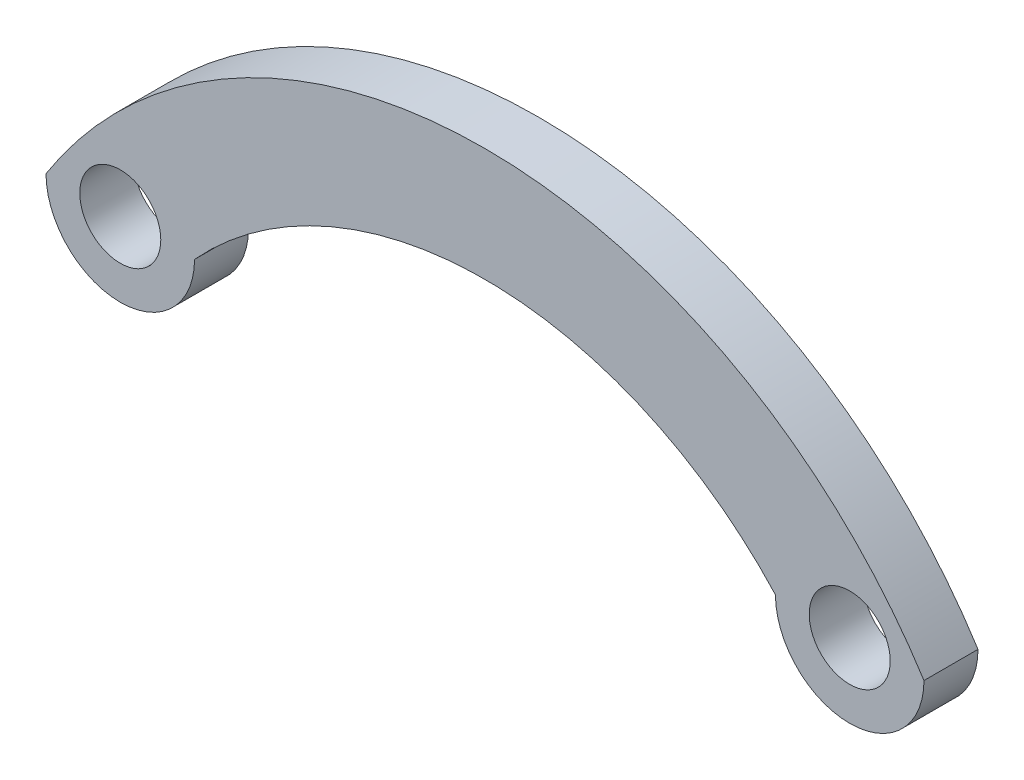
ISO-10303-21;
HEADER;
FILE_DESCRIPTION(('STEP AP214'),'2;1');
FILE_NAME('part.step','',(''),(''),'','','');
FILE_SCHEMA(('AUTOMOTIVE_DESIGN { 1 0 10303 214 1 1 1 1 }'));
ENDSEC;
DATA;
#1=APPLICATION_CONTEXT('core data for automotive mechanical design processes');
#2=APPLICATION_PROTOCOL_DEFINITION('international standard','automotive_design',2000,#1);
#3=PRODUCT_CONTEXT('',#1,'mechanical');
#4=PRODUCT('Part','Part','',(#3));
#5=PRODUCT_RELATED_PRODUCT_CATEGORY('part','',(#4));
#6=PRODUCT_DEFINITION_FORMATION('','',#4);
#7=PRODUCT_DEFINITION_CONTEXT('part definition',#1,'design');
#8=PRODUCT_DEFINITION('design','',#6,#7);
#9=PRODUCT_DEFINITION_SHAPE('','',#8);
#10=(LENGTH_UNIT() NAMED_UNIT(*) SI_UNIT(.MILLI.,.METRE.));
#11=(NAMED_UNIT(*) PLANE_ANGLE_UNIT() SI_UNIT($,.RADIAN.));
#12=(NAMED_UNIT(*) SI_UNIT($,.STERADIAN.) SOLID_ANGLE_UNIT());
#13=UNCERTAINTY_MEASURE_WITH_UNIT(LENGTH_MEASURE(1.E-05),#10,'distance_accuracy_value','');
#14=(GEOMETRIC_REPRESENTATION_CONTEXT(3) GLOBAL_UNCERTAINTY_ASSIGNED_CONTEXT((#13)) GLOBAL_UNIT_ASSIGNED_CONTEXT((#10,
#11,#12)) REPRESENTATION_CONTEXT('',''));
#15=CARTESIAN_POINT('',(0.,0.,0.));
#16=DIRECTION('',(0.,0.,1.));
#17=DIRECTION('',(1.,0.,0.));
#18=AXIS2_PLACEMENT_3D('',#15,#16,#17);
#19=CARTESIAN_POINT('',(5.5,0.,4.));
#20=DIRECTION('',(0.,0.,-1.));
#21=DIRECTION('',(-1.,0.,0.));
#22=AXIS2_PLACEMENT_3D('',#19,#20,#21);
#23=CYLINDRICAL_SURFACE('',#22,5.5);
#24=CARTESIAN_POINT('',(5.5,0.,0.));
#25=DIRECTION('',(0.,0.,1.));
#26=DIRECTION('',(1.,0.,0.));
#27=AXIS2_PLACEMENT_3D('',#24,#25,#26);
#28=CIRCLE('',#27,5.5);
#29=CARTESIAN_POINT('',(0.,0.,0.));
#30=VERTEX_POINT('',#29);
#31=CARTESIAN_POINT('',(11.,0.,0.));
#32=VERTEX_POINT('',#31);
#33=EDGE_CURVE('E96',#30,#32,#28,.T.);
#34=ORIENTED_EDGE('',*,*,#33,.T.);
#35=DIRECTION('',(0.,0.,-1.));
#36=VECTOR('',#35,1.);
#37=CARTESIAN_POINT('',(11.,0.,4.));
#38=LINE('',#37,#36);
#39=CARTESIAN_POINT('',(11.,0.,4.));
#40=VERTEX_POINT('',#39);
#41=EDGE_CURVE('E11',#40,#32,#38,.T.);
#42=ORIENTED_EDGE('',*,*,#41,.F.);
#43=CARTESIAN_POINT('',(5.5,0.,4.));
#44=DIRECTION('',(0.,0.,1.));
#45=DIRECTION('',(1.,0.,0.));
#46=AXIS2_PLACEMENT_3D('',#43,#44,#45);
#47=CIRCLE('',#46,5.5);
#48=CARTESIAN_POINT('',(0.,0.,4.));
#49=VERTEX_POINT('',#48);
#50=EDGE_CURVE('E84',#49,#40,#47,.T.);
#51=ORIENTED_EDGE('',*,*,#50,.F.);
#52=DIRECTION('',(0.,0.,-1.));
#53=VECTOR('',#52,1.);
#54=CARTESIAN_POINT('',(0.,0.,4.));
#55=LINE('',#54,#53);
#56=EDGE_CURVE('E92',#49,#30,#55,.T.);
#57=ORIENTED_EDGE('',*,*,#56,.T.);
#58=EDGE_LOOP('',(#34,#42,#51,#57));
#59=FACE_BOUND('',#58,.T.);
#60=ADVANCED_FACE('F33',(#59),#23,.T.);
#61=CARTESIAN_POINT('',(32.5084600569508,-19.6845144983669,4.));
#62=DIRECTION('',(0.,0.,-1.));
#63=DIRECTION('',(-1.,0.,0.));
#64=AXIS2_PLACEMENT_3D('',#61,#62,#63);
#65=CYLINDRICAL_SURFACE('',#64,29.1563709171403);
#66=CARTESIAN_POINT('',(32.5084600569508,-19.6845144983669,0.));
#67=DIRECTION('',(0.,0.,-1.));
#68=DIRECTION('',(-1.,0.,0.));
#69=AXIS2_PLACEMENT_3D('',#66,#67,#68);
#70=CIRCLE('',#69,29.1563709171403);
#71=CARTESIAN_POINT('',(54.0169201139016,0.,0.));
#72=VERTEX_POINT('',#71);
#73=EDGE_CURVE('E88',#32,#72,#70,.T.);
#74=ORIENTED_EDGE('',*,*,#73,.T.);
#75=DIRECTION('',(0.,0.,-1.));
#76=VECTOR('',#75,1.);
#77=CARTESIAN_POINT('',(54.0169201139016,0.,4.));
#78=LINE('',#77,#76);
#79=CARTESIAN_POINT('',(54.0169201139016,0.,4.));
#80=VERTEX_POINT('',#79);
#81=EDGE_CURVE('E41',#80,#72,#78,.T.);
#82=ORIENTED_EDGE('',*,*,#81,.F.);
#83=CARTESIAN_POINT('',(32.5084600569508,-19.6845144983669,4.));
#84=DIRECTION('',(0.,0.,-1.));
#85=DIRECTION('',(-1.,0.,0.));
#86=AXIS2_PLACEMENT_3D('',#83,#84,#85);
#87=CIRCLE('',#86,29.1563709171403);
#88=EDGE_CURVE('E79',#40,#80,#87,.T.);
#89=ORIENTED_EDGE('',*,*,#88,.F.);
#90=ORIENTED_EDGE('',*,*,#41,.T.);
#91=EDGE_LOOP('',(#74,#82,#89,#90));
#92=FACE_BOUND('',#91,.T.);
#93=ADVANCED_FACE('F87',(#92),#65,.F.);
#94=CARTESIAN_POINT('',(59.5169201139016,0.,4.));
#95=DIRECTION('',(0.,0.,-1.));
#96=DIRECTION('',(-1.,0.,0.));
#97=AXIS2_PLACEMENT_3D('',#94,#95,#96);
#98=CYLINDRICAL_SURFACE('',#97,5.5);
#99=CARTESIAN_POINT('',(59.5169201139016,0.,0.));
#100=DIRECTION('',(0.,0.,1.));
#101=DIRECTION('',(1.,0.,0.));
#102=AXIS2_PLACEMENT_3D('',#99,#100,#101);
#103=CIRCLE('',#102,5.5);
#104=CARTESIAN_POINT('',(65.0169201139016,0.,0.));
#105=VERTEX_POINT('',#104);
#106=EDGE_CURVE('E66',#72,#105,#103,.T.);
#107=ORIENTED_EDGE('',*,*,#106,.T.);
#108=DIRECTION('',(0.,0.,-1.));
#109=VECTOR('',#108,1.);
#110=CARTESIAN_POINT('',(65.0169201139016,0.,4.));
#111=LINE('',#110,#109);
#112=CARTESIAN_POINT('',(65.0169201139016,0.,4.));
#113=VERTEX_POINT('',#112);
#114=EDGE_CURVE('E89',#113,#105,#111,.T.);
#115=ORIENTED_EDGE('',*,*,#114,.F.);
#116=CARTESIAN_POINT('',(59.5169201139016,0.,4.));
#117=DIRECTION('',(0.,0.,1.));
#118=DIRECTION('',(1.,0.,0.));
#119=AXIS2_PLACEMENT_3D('',#116,#117,#118);
#120=CIRCLE('',#119,5.5);
#121=EDGE_CURVE('E82',#80,#113,#120,.T.);
#122=ORIENTED_EDGE('',*,*,#121,.F.);
#123=ORIENTED_EDGE('',*,*,#81,.T.);
#124=EDGE_LOOP('',(#107,#115,#122,#123));
#125=FACE_BOUND('',#124,.T.);
#126=ADVANCED_FACE('F90',(#125),#98,.T.);
#127=CARTESIAN_POINT('',(32.5084600569508,-20.6435246543507,4.));
#128=DIRECTION('',(0.,0.,-1.));
#129=DIRECTION('',(-1.,0.,0.));
#130=AXIS2_PLACEMENT_3D('',#127,#128,#129);
#131=CYLINDRICAL_SURFACE('',#130,38.5091558649258);
#132=CARTESIAN_POINT('',(32.5084600569508,-20.6435246543507,0.));
#133=DIRECTION('',(0.,0.,1.));
#134=DIRECTION('',(-1.,0.,0.));
#135=AXIS2_PLACEMENT_3D('',#132,#133,#134);
#136=CIRCLE('',#135,38.5091558649258);
#137=EDGE_CURVE('E72',#105,#30,#136,.T.);
#138=ORIENTED_EDGE('',*,*,#137,.T.);
#139=ORIENTED_EDGE('',*,*,#56,.F.);
#140=CARTESIAN_POINT('',(32.5084600569508,-20.6435246543507,4.));
#141=DIRECTION('',(0.,0.,1.));
#142=DIRECTION('',(-1.,0.,0.));
#143=AXIS2_PLACEMENT_3D('',#140,#141,#142);
#144=CIRCLE('',#143,38.5091558649258);
#145=EDGE_CURVE('E49',#113,#49,#144,.T.);
#146=ORIENTED_EDGE('',*,*,#145,.F.);
#147=ORIENTED_EDGE('',*,*,#114,.T.);
#148=EDGE_LOOP('',(#138,#139,#146,#147));
#149=FACE_BOUND('',#148,.T.);
#150=ADVANCED_FACE('F104',(#149),#131,.T.);
#151=CARTESIAN_POINT('',(19.0042300284754,-9.84225724918347,4.));
#152=DIRECTION('',(0.,0.,1.));
#153=DIRECTION('',(1.,0.,0.));
#154=AXIS2_PLACEMENT_3D('',#151,#152,#153);
#155=PLANE('',#154);
#156=CARTESIAN_POINT('',(59.5169201139016,0.,4.));
#157=DIRECTION('',(0.,0.,1.));
#158=DIRECTION('',(1.,0.,0.));
#159=AXIS2_PLACEMENT_3D('',#156,#157,#158);
#160=CIRCLE('',#159,2.99999999999999);
#161=CARTESIAN_POINT('',(62.5169201139016,0.,4.));
#162=VERTEX_POINT('',#161);
#163=EDGE_CURVE('E116',#162,#162,#160,.T.);
#164=ORIENTED_EDGE('',*,*,#163,.F.);
#165=EDGE_LOOP('',(#164));
#166=FACE_BOUND('',#165,.T.);
#167=CARTESIAN_POINT('',(5.5,0.,4.));
#168=DIRECTION('',(0.,0.,1.));
#169=DIRECTION('',(1.,0.,0.));
#170=AXIS2_PLACEMENT_3D('',#167,#168,#169);
#171=CIRCLE('',#170,3.);
#172=CARTESIAN_POINT('',(8.5,0.,4.));
#173=VERTEX_POINT('',#172);
#174=EDGE_CURVE('E110',#173,#173,#171,.T.);
#175=ORIENTED_EDGE('',*,*,#174,.F.);
#176=EDGE_LOOP('',(#175));
#177=FACE_BOUND('',#176,.T.);
#178=ORIENTED_EDGE('',*,*,#50,.T.);
#179=ORIENTED_EDGE('',*,*,#88,.T.);
#180=ORIENTED_EDGE('',*,*,#121,.T.);
#181=ORIENTED_EDGE('',*,*,#145,.T.);
#182=EDGE_LOOP('',(#178,#179,#180,#181));
#183=FACE_BOUND('',#182,.T.);
#184=ADVANCED_FACE('F80',(#166,#177,#183),#155,.T.);
#185=CARTESIAN_POINT('',(19.0042300284754,-9.84225724918347,0.));
#186=DIRECTION('',(0.,0.,1.));
#187=DIRECTION('',(1.,0.,0.));
#188=AXIS2_PLACEMENT_3D('',#185,#186,#187);
#189=PLANE('',#188);
#190=CARTESIAN_POINT('',(59.5169201139016,0.,0.));
#191=DIRECTION('',(0.,0.,1.));
#192=DIRECTION('',(1.,0.,0.));
#193=AXIS2_PLACEMENT_3D('',#190,#191,#192);
#194=CIRCLE('',#193,2.99999999999999);
#195=CARTESIAN_POINT('',(62.5169201139016,0.,0.));
#196=VERTEX_POINT('',#195);
#197=EDGE_CURVE('E113',#196,#196,#194,.T.);
#198=ORIENTED_EDGE('',*,*,#197,.T.);
#199=EDGE_LOOP('',(#198));
#200=FACE_BOUND('',#199,.T.);
#201=CARTESIAN_POINT('',(5.5,0.,0.));
#202=DIRECTION('',(0.,0.,1.));
#203=DIRECTION('',(1.,0.,0.));
#204=AXIS2_PLACEMENT_3D('',#201,#202,#203);
#205=CIRCLE('',#204,3.);
#206=CARTESIAN_POINT('',(8.5,0.,0.));
#207=VERTEX_POINT('',#206);
#208=EDGE_CURVE('E99',#207,#207,#205,.T.);
#209=ORIENTED_EDGE('',*,*,#208,.T.);
#210=EDGE_LOOP('',(#209));
#211=FACE_BOUND('',#210,.T.);
#212=ORIENTED_EDGE('',*,*,#33,.F.);
#213=ORIENTED_EDGE('',*,*,#137,.F.);
#214=ORIENTED_EDGE('',*,*,#106,.F.);
#215=ORIENTED_EDGE('',*,*,#73,.F.);
#216=EDGE_LOOP('',(#212,#213,#214,#215));
#217=FACE_BOUND('',#216,.T.);
#218=ADVANCED_FACE('F107',(#200,#211,#217),#189,.F.);
#219=CARTESIAN_POINT('',(5.5,0.,0.));
#220=DIRECTION('',(0.,0.,1.));
#221=DIRECTION('',(1.,0.,0.));
#222=AXIS2_PLACEMENT_3D('',#219,#220,#221);
#223=CYLINDRICAL_SURFACE('',#222,3.);
#224=ORIENTED_EDGE('',*,*,#208,.F.);
#225=EDGE_LOOP('',(#224));
#226=FACE_BOUND('',#225,.T.);
#227=ORIENTED_EDGE('',*,*,#174,.T.);
#228=EDGE_LOOP('',(#227));
#229=FACE_BOUND('',#228,.T.);
#230=ADVANCED_FACE('F127',(#226,#229),#223,.F.);
#231=CARTESIAN_POINT('',(59.5169201139016,0.,0.));
#232=DIRECTION('',(0.,0.,1.));
#233=DIRECTION('',(1.,0.,0.));
#234=AXIS2_PLACEMENT_3D('',#231,#232,#233);
#235=CYLINDRICAL_SURFACE('',#234,2.99999999999999);
#236=ORIENTED_EDGE('',*,*,#197,.F.);
#237=EDGE_LOOP('',(#236));
#238=FACE_BOUND('',#237,.T.);
#239=ORIENTED_EDGE('',*,*,#163,.T.);
#240=EDGE_LOOP('',(#239));
#241=FACE_BOUND('',#240,.T.);
#242=ADVANCED_FACE('F124',(#238,#241),#235,.F.);
#243=CLOSED_SHELL('',(#60,#93,#126,#150,#184,#218,#230,#242));
#244=MANIFOLD_SOLID_BREP('B2',#243);
#245=ADVANCED_BREP_SHAPE_REPRESENTATION('',(#18,#244),#14);
#246=SHAPE_DEFINITION_REPRESENTATION(#9,#245);
ENDSEC;
END-ISO-10303-21;
